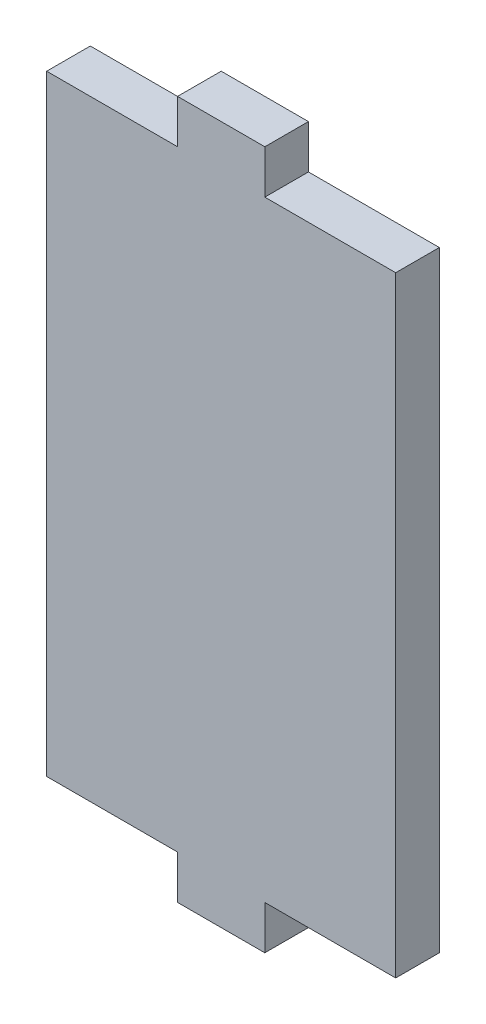
ISO-10303-21;
HEADER;
FILE_DESCRIPTION(('STEP AP214'),'2;1');
FILE_NAME('part.step','',(''),(''),'','','');
FILE_SCHEMA(('AUTOMOTIVE_DESIGN { 1 0 10303 214 1 1 1 1 }'));
ENDSEC;
DATA;
#1=APPLICATION_CONTEXT('core data for automotive mechanical design processes');
#2=APPLICATION_PROTOCOL_DEFINITION('international standard','automotive_design',2000,#1);
#3=PRODUCT_CONTEXT('',#1,'mechanical');
#4=PRODUCT('Part','Part','',(#3));
#5=PRODUCT_RELATED_PRODUCT_CATEGORY('part','',(#4));
#6=PRODUCT_DEFINITION_FORMATION('','',#4);
#7=PRODUCT_DEFINITION_CONTEXT('part definition',#1,'design');
#8=PRODUCT_DEFINITION('design','',#6,#7);
#9=PRODUCT_DEFINITION_SHAPE('','',#8);
#10=(LENGTH_UNIT() NAMED_UNIT(*) SI_UNIT(.MILLI.,.METRE.));
#11=(NAMED_UNIT(*) PLANE_ANGLE_UNIT() SI_UNIT($,.RADIAN.));
#12=(NAMED_UNIT(*) SI_UNIT($,.STERADIAN.) SOLID_ANGLE_UNIT());
#13=UNCERTAINTY_MEASURE_WITH_UNIT(LENGTH_MEASURE(1.E-05),#10,'distance_accuracy_value','');
#14=(GEOMETRIC_REPRESENTATION_CONTEXT(3) GLOBAL_UNCERTAINTY_ASSIGNED_CONTEXT((#13)) GLOBAL_UNIT_ASSIGNED_CONTEXT((#10,
#11,#12)) REPRESENTATION_CONTEXT('',''));
#15=CARTESIAN_POINT('',(0.,0.,0.));
#16=DIRECTION('',(0.,0.,1.));
#17=DIRECTION('',(1.,0.,0.));
#18=AXIS2_PLACEMENT_3D('',#15,#16,#17);
#19=CARTESIAN_POINT('',(3.175,0.,3.175));
#20=DIRECTION('',(-1.,0.,0.));
#21=DIRECTION('',(0.,-1.,0.));
#22=AXIS2_PLACEMENT_3D('',#19,#20,#21);
#23=PLANE('',#22);
#24=DIRECTION('',(0.,1.,0.));
#25=VECTOR('',#24,1.);
#26=CARTESIAN_POINT('',(3.175,0.,0.));
#27=LINE('',#26,#25);
#28=CARTESIAN_POINT('',(3.175,0.,0.));
#29=VERTEX_POINT('',#28);
#30=CARTESIAN_POINT('',(3.175,3.175,0.));
#31=VERTEX_POINT('',#30);
#32=EDGE_CURVE('E247',#29,#31,#27,.T.);
#33=ORIENTED_EDGE('',*,*,#32,.T.);
#34=DIRECTION('',(0.,0.,-1.));
#35=VECTOR('',#34,1.);
#36=CARTESIAN_POINT('',(3.175,3.175,3.175));
#37=LINE('',#36,#35);
#38=CARTESIAN_POINT('',(3.175,3.175,3.175));
#39=VERTEX_POINT('',#38);
#40=EDGE_CURVE('E12',#39,#31,#37,.T.);
#41=ORIENTED_EDGE('',*,*,#40,.F.);
#42=DIRECTION('',(0.,1.,0.));
#43=VECTOR('',#42,1.);
#44=CARTESIAN_POINT('',(3.175,0.,3.175));
#45=LINE('',#44,#43);
#46=CARTESIAN_POINT('',(3.175,0.,3.175));
#47=VERTEX_POINT('',#46);
#48=EDGE_CURVE('E200',#47,#39,#45,.T.);
#49=ORIENTED_EDGE('',*,*,#48,.F.);
#50=DIRECTION('',(0.,0.,-1.));
#51=VECTOR('',#50,1.);
#52=CARTESIAN_POINT('',(3.175,0.,3.175));
#53=LINE('',#52,#51);
#54=EDGE_CURVE('E156',#47,#29,#53,.T.);
#55=ORIENTED_EDGE('',*,*,#54,.T.);
#56=EDGE_LOOP('',(#33,#41,#49,#55));
#57=FACE_BOUND('',#56,.T.);
#58=ADVANCED_FACE('F37',(#57),#23,.F.);
#59=CARTESIAN_POINT('',(3.175,3.175,3.175));
#60=DIRECTION('',(0.,1.,0.));
#61=DIRECTION('',(-1.,0.,0.));
#62=AXIS2_PLACEMENT_3D('',#59,#60,#61);
#63=PLANE('',#62);
#64=DIRECTION('',(1.,0.,0.));
#65=VECTOR('',#64,1.);
#66=CARTESIAN_POINT('',(3.175,3.175,0.));
#67=LINE('',#66,#65);
#68=CARTESIAN_POINT('',(12.7,3.17500000000001,0.));
#69=VERTEX_POINT('',#68);
#70=EDGE_CURVE('E241',#31,#69,#67,.T.);
#71=ORIENTED_EDGE('',*,*,#70,.T.);
#72=DIRECTION('',(0.,0.,-1.));
#73=VECTOR('',#72,1.);
#74=CARTESIAN_POINT('',(12.7,3.17500000000001,3.175));
#75=LINE('',#74,#73);
#76=CARTESIAN_POINT('',(12.7,3.17500000000001,3.175));
#77=VERTEX_POINT('',#76);
#78=EDGE_CURVE('E45',#77,#69,#75,.T.);
#79=ORIENTED_EDGE('',*,*,#78,.F.);
#80=DIRECTION('',(1.,0.,0.));
#81=VECTOR('',#80,1.);
#82=CARTESIAN_POINT('',(3.175,3.175,3.175));
#83=LINE('',#82,#81);
#84=EDGE_CURVE('E108',#39,#77,#83,.T.);
#85=ORIENTED_EDGE('',*,*,#84,.F.);
#86=ORIENTED_EDGE('',*,*,#40,.T.);
#87=EDGE_LOOP('',(#71,#79,#85,#86));
#88=FACE_BOUND('',#87,.T.);
#89=ADVANCED_FACE('F276',(#88),#63,.F.);
#90=CARTESIAN_POINT('',(12.7,3.17500000000001,3.175));
#91=DIRECTION('',(-1.,0.,0.));
#92=DIRECTION('',(0.,0.,1.));
#93=AXIS2_PLACEMENT_3D('',#90,#91,#92);
#94=PLANE('',#93);
#95=DIRECTION('',(0.,1.,0.));
#96=VECTOR('',#95,1.);
#97=CARTESIAN_POINT('',(12.7,3.17500000000001,0.));
#98=LINE('',#97,#96);
#99=CARTESIAN_POINT('',(12.7,47.625,0.));
#100=VERTEX_POINT('',#99);
#101=EDGE_CURVE('E236',#69,#100,#98,.T.);
#102=ORIENTED_EDGE('',*,*,#101,.T.);
#103=DIRECTION('',(0.,0.,-1.));
#104=VECTOR('',#103,1.);
#105=CARTESIAN_POINT('',(12.7,47.625,3.175));
#106=LINE('',#105,#104);
#107=CARTESIAN_POINT('',(12.7,47.625,3.175));
#108=VERTEX_POINT('',#107);
#109=EDGE_CURVE('E228',#108,#100,#106,.T.);
#110=ORIENTED_EDGE('',*,*,#109,.F.);
#111=DIRECTION('',(0.,1.,0.));
#112=VECTOR('',#111,1.);
#113=CARTESIAN_POINT('',(12.7,3.17500000000001,3.175));
#114=LINE('',#113,#112);
#115=EDGE_CURVE('E192',#77,#108,#114,.T.);
#116=ORIENTED_EDGE('',*,*,#115,.F.);
#117=ORIENTED_EDGE('',*,*,#78,.T.);
#118=EDGE_LOOP('',(#102,#110,#116,#117));
#119=FACE_BOUND('',#118,.T.);
#120=ADVANCED_FACE('F234',(#119),#94,.F.);
#121=CARTESIAN_POINT('',(12.7,47.625,3.175));
#122=DIRECTION('',(0.,-1.,0.));
#123=DIRECTION('',(1.,0.,0.));
#124=AXIS2_PLACEMENT_3D('',#121,#122,#123);
#125=PLANE('',#124);
#126=DIRECTION('',(-1.,0.,0.));
#127=VECTOR('',#126,1.);
#128=CARTESIAN_POINT('',(12.7,47.625,0.));
#129=LINE('',#128,#127);
#130=CARTESIAN_POINT('',(3.17499999999999,47.625,0.));
#131=VERTEX_POINT('',#130);
#132=EDGE_CURVE('E243',#100,#131,#129,.T.);
#133=ORIENTED_EDGE('',*,*,#132,.T.);
#134=DIRECTION('',(0.,0.,-1.));
#135=VECTOR('',#134,1.);
#136=CARTESIAN_POINT('',(3.17499999999999,47.625,3.175));
#137=LINE('',#136,#135);
#138=CARTESIAN_POINT('',(3.17499999999999,47.625,3.175));
#139=VERTEX_POINT('',#138);
#140=EDGE_CURVE('E225',#139,#131,#137,.T.);
#141=ORIENTED_EDGE('',*,*,#140,.F.);
#142=DIRECTION('',(-1.,0.,0.));
#143=VECTOR('',#142,1.);
#144=CARTESIAN_POINT('',(12.7,47.625,3.175));
#145=LINE('',#144,#143);
#146=EDGE_CURVE('E188',#108,#139,#145,.T.);
#147=ORIENTED_EDGE('',*,*,#146,.F.);
#148=ORIENTED_EDGE('',*,*,#109,.T.);
#149=EDGE_LOOP('',(#133,#141,#147,#148));
#150=FACE_BOUND('',#149,.T.);
#151=ADVANCED_FACE('F283',(#150),#125,.F.);
#152=CARTESIAN_POINT('',(3.17499999999999,47.625,3.175));
#153=DIRECTION('',(-1.,0.,0.));
#154=DIRECTION('',(0.,-1.,0.));
#155=AXIS2_PLACEMENT_3D('',#152,#153,#154);
#156=PLANE('',#155);
#157=DIRECTION('',(0.,1.,0.));
#158=VECTOR('',#157,1.);
#159=CARTESIAN_POINT('',(3.17499999999999,47.625,0.));
#160=LINE('',#159,#158);
#161=CARTESIAN_POINT('',(3.17499999999999,50.8,0.));
#162=VERTEX_POINT('',#161);
#163=EDGE_CURVE('E245',#131,#162,#160,.T.);
#164=ORIENTED_EDGE('',*,*,#163,.T.);
#165=DIRECTION('',(0.,0.,-1.));
#166=VECTOR('',#165,1.);
#167=CARTESIAN_POINT('',(3.17499999999999,50.8,3.175));
#168=LINE('',#167,#166);
#169=CARTESIAN_POINT('',(3.17499999999999,50.8,3.175));
#170=VERTEX_POINT('',#169);
#171=EDGE_CURVE('E222',#170,#162,#168,.T.);
#172=ORIENTED_EDGE('',*,*,#171,.F.);
#173=DIRECTION('',(0.,1.,0.));
#174=VECTOR('',#173,1.);
#175=CARTESIAN_POINT('',(3.17499999999999,47.625,3.175));
#176=LINE('',#175,#174);
#177=EDGE_CURVE('E185',#139,#170,#176,.T.);
#178=ORIENTED_EDGE('',*,*,#177,.F.);
#179=ORIENTED_EDGE('',*,*,#140,.T.);
#180=EDGE_LOOP('',(#164,#172,#178,#179));
#181=FACE_BOUND('',#180,.T.);
#182=ADVANCED_FACE('F288',(#181),#156,.F.);
#183=CARTESIAN_POINT('',(3.17499999999999,50.8,3.175));
#184=DIRECTION('',(0.,-1.,0.));
#185=DIRECTION('',(0.,0.,-1.));
#186=AXIS2_PLACEMENT_3D('',#183,#184,#185);
#187=PLANE('',#186);
#188=DIRECTION('',(-1.,0.,0.));
#189=VECTOR('',#188,1.);
#190=CARTESIAN_POINT('',(3.17499999999999,50.8,0.));
#191=LINE('',#190,#189);
#192=CARTESIAN_POINT('',(-3.17500000000001,50.8,0.));
#193=VERTEX_POINT('',#192);
#194=EDGE_CURVE('E251',#162,#193,#191,.T.);
#195=ORIENTED_EDGE('',*,*,#194,.T.);
#196=DIRECTION('',(0.,0.,-1.));
#197=VECTOR('',#196,1.);
#198=CARTESIAN_POINT('',(-3.17500000000001,50.8,3.175));
#199=LINE('',#198,#197);
#200=CARTESIAN_POINT('',(-3.17500000000001,50.8,3.175));
#201=VERTEX_POINT('',#200);
#202=EDGE_CURVE('E219',#201,#193,#199,.T.);
#203=ORIENTED_EDGE('',*,*,#202,.F.);
#204=DIRECTION('',(-1.,0.,0.));
#205=VECTOR('',#204,1.);
#206=CARTESIAN_POINT('',(3.17499999999999,50.8,3.175));
#207=LINE('',#206,#205);
#208=EDGE_CURVE('E177',#170,#201,#207,.T.);
#209=ORIENTED_EDGE('',*,*,#208,.F.);
#210=ORIENTED_EDGE('',*,*,#171,.T.);
#211=EDGE_LOOP('',(#195,#203,#209,#210));
#212=FACE_BOUND('',#211,.T.);
#213=ADVANCED_FACE('F292',(#212),#187,.F.);
#214=CARTESIAN_POINT('',(-3.17500000000001,50.8,3.175));
#215=DIRECTION('',(1.,0.,0.));
#216=DIRECTION('',(0.,1.,0.));
#217=AXIS2_PLACEMENT_3D('',#214,#215,#216);
#218=PLANE('',#217);
#219=DIRECTION('',(0.,-1.,0.));
#220=VECTOR('',#219,1.);
#221=CARTESIAN_POINT('',(-3.17500000000001,50.8,0.));
#222=LINE('',#221,#220);
#223=CARTESIAN_POINT('',(-3.17500000000001,47.625,0.));
#224=VERTEX_POINT('',#223);
#225=EDGE_CURVE('E253',#193,#224,#222,.T.);
#226=ORIENTED_EDGE('',*,*,#225,.T.);
#227=DIRECTION('',(0.,0.,-1.));
#228=VECTOR('',#227,1.);
#229=CARTESIAN_POINT('',(-3.17500000000001,47.625,3.175));
#230=LINE('',#229,#228);
#231=CARTESIAN_POINT('',(-3.17500000000001,47.625,3.175));
#232=VERTEX_POINT('',#231);
#233=EDGE_CURVE('E216',#232,#224,#230,.T.);
#234=ORIENTED_EDGE('',*,*,#233,.F.);
#235=DIRECTION('',(0.,-1.,0.));
#236=VECTOR('',#235,1.);
#237=CARTESIAN_POINT('',(-3.17500000000001,50.8,3.175));
#238=LINE('',#237,#236);
#239=EDGE_CURVE('E173',#201,#232,#238,.T.);
#240=ORIENTED_EDGE('',*,*,#239,.F.);
#241=ORIENTED_EDGE('',*,*,#202,.T.);
#242=EDGE_LOOP('',(#226,#234,#240,#241));
#243=FACE_BOUND('',#242,.T.);
#244=ADVANCED_FACE('F296',(#243),#218,.F.);
#245=CARTESIAN_POINT('',(-3.17500000000001,47.625,3.175));
#246=DIRECTION('',(0.,-1.,0.));
#247=DIRECTION('',(0.,0.,-1.));
#248=AXIS2_PLACEMENT_3D('',#245,#246,#247);
#249=PLANE('',#248);
#250=DIRECTION('',(-1.,0.,0.));
#251=VECTOR('',#250,1.);
#252=CARTESIAN_POINT('',(-3.17500000000001,47.625,0.));
#253=LINE('',#252,#251);
#254=CARTESIAN_POINT('',(-12.7,47.625,0.));
#255=VERTEX_POINT('',#254);
#256=EDGE_CURVE('E255',#224,#255,#253,.T.);
#257=ORIENTED_EDGE('',*,*,#256,.T.);
#258=DIRECTION('',(0.,0.,-1.));
#259=VECTOR('',#258,1.);
#260=CARTESIAN_POINT('',(-12.7,47.625,3.175));
#261=LINE('',#260,#259);
#262=CARTESIAN_POINT('',(-12.7,47.625,3.175));
#263=VERTEX_POINT('',#262);
#264=EDGE_CURVE('E213',#263,#255,#261,.T.);
#265=ORIENTED_EDGE('',*,*,#264,.F.);
#266=DIRECTION('',(-1.,0.,0.));
#267=VECTOR('',#266,1.);
#268=CARTESIAN_POINT('',(-3.17500000000001,47.625,3.175));
#269=LINE('',#268,#267);
#270=EDGE_CURVE('E169',#232,#263,#269,.T.);
#271=ORIENTED_EDGE('',*,*,#270,.F.);
#272=ORIENTED_EDGE('',*,*,#233,.T.);
#273=EDGE_LOOP('',(#257,#265,#271,#272));
#274=FACE_BOUND('',#273,.T.);
#275=ADVANCED_FACE('F300',(#274),#249,.F.);
#276=CARTESIAN_POINT('',(-12.7,47.625,3.175));
#277=DIRECTION('',(1.,0.,0.));
#278=DIRECTION('',(0.,1.,0.));
#279=AXIS2_PLACEMENT_3D('',#276,#277,#278);
#280=PLANE('',#279);
#281=DIRECTION('',(0.,-1.,0.));
#282=VECTOR('',#281,1.);
#283=CARTESIAN_POINT('',(-12.7,47.625,0.));
#284=LINE('',#283,#282);
#285=CARTESIAN_POINT('',(-12.7,3.175,0.));
#286=VERTEX_POINT('',#285);
#287=EDGE_CURVE('E257',#255,#286,#284,.T.);
#288=ORIENTED_EDGE('',*,*,#287,.T.);
#289=DIRECTION('',(0.,0.,-1.));
#290=VECTOR('',#289,1.);
#291=CARTESIAN_POINT('',(-12.7,3.175,3.175));
#292=LINE('',#291,#290);
#293=CARTESIAN_POINT('',(-12.7,3.175,3.175));
#294=VERTEX_POINT('',#293);
#295=EDGE_CURVE('E149',#294,#286,#292,.T.);
#296=ORIENTED_EDGE('',*,*,#295,.F.);
#297=DIRECTION('',(0.,-1.,0.));
#298=VECTOR('',#297,1.);
#299=CARTESIAN_POINT('',(-12.7,47.625,3.175));
#300=LINE('',#299,#298);
#301=EDGE_CURVE('E139',#263,#294,#300,.T.);
#302=ORIENTED_EDGE('',*,*,#301,.F.);
#303=ORIENTED_EDGE('',*,*,#264,.T.);
#304=EDGE_LOOP('',(#288,#296,#302,#303));
#305=FACE_BOUND('',#304,.T.);
#306=ADVANCED_FACE('F260',(#305),#280,.F.);
#307=CARTESIAN_POINT('',(-12.7,3.175,3.175));
#308=DIRECTION('',(0.,1.,0.));
#309=DIRECTION('',(-1.,0.,0.));
#310=AXIS2_PLACEMENT_3D('',#307,#308,#309);
#311=PLANE('',#310);
#312=DIRECTION('',(1.,0.,0.));
#313=VECTOR('',#312,1.);
#314=CARTESIAN_POINT('',(-12.7,3.175,0.));
#315=LINE('',#314,#313);
#316=CARTESIAN_POINT('',(-3.175,3.175,0.));
#317=VERTEX_POINT('',#316);
#318=EDGE_CURVE('E148',#286,#317,#315,.T.);
#319=ORIENTED_EDGE('',*,*,#318,.T.);
#320=DIRECTION('',(0.,0.,-1.));
#321=VECTOR('',#320,1.);
#322=CARTESIAN_POINT('',(-3.175,3.175,3.175));
#323=LINE('',#322,#321);
#324=CARTESIAN_POINT('',(-3.175,3.175,3.175));
#325=VERTEX_POINT('',#324);
#326=EDGE_CURVE('E145',#325,#317,#323,.T.);
#327=ORIENTED_EDGE('',*,*,#326,.F.);
#328=DIRECTION('',(1.,0.,0.));
#329=VECTOR('',#328,1.);
#330=CARTESIAN_POINT('',(-12.7,3.175,3.175));
#331=LINE('',#330,#329);
#332=EDGE_CURVE('E133',#294,#325,#331,.T.);
#333=ORIENTED_EDGE('',*,*,#332,.F.);
#334=ORIENTED_EDGE('',*,*,#295,.T.);
#335=EDGE_LOOP('',(#319,#327,#333,#334));
#336=FACE_BOUND('',#335,.T.);
#337=ADVANCED_FACE('F146',(#336),#311,.F.);
#338=CARTESIAN_POINT('',(-3.175,3.175,3.175));
#339=DIRECTION('',(1.,0.,0.));
#340=DIRECTION('',(0.,1.,0.));
#341=AXIS2_PLACEMENT_3D('',#338,#339,#340);
#342=PLANE('',#341);
#343=DIRECTION('',(0.,-1.,0.));
#344=VECTOR('',#343,1.);
#345=CARTESIAN_POINT('',(-3.175,3.175,0.));
#346=LINE('',#345,#344);
#347=CARTESIAN_POINT('',(-3.175,0.,0.));
#348=VERTEX_POINT('',#347);
#349=EDGE_CURVE('E94',#317,#348,#346,.T.);
#350=ORIENTED_EDGE('',*,*,#349,.T.);
#351=DIRECTION('',(0.,0.,-1.));
#352=VECTOR('',#351,1.);
#353=CARTESIAN_POINT('',(-3.175,0.,3.175));
#354=LINE('',#353,#352);
#355=CARTESIAN_POINT('',(-3.175,0.,3.175));
#356=VERTEX_POINT('',#355);
#357=EDGE_CURVE('E150',#356,#348,#354,.T.);
#358=ORIENTED_EDGE('',*,*,#357,.F.);
#359=DIRECTION('',(0.,-1.,0.));
#360=VECTOR('',#359,1.);
#361=CARTESIAN_POINT('',(-3.175,3.175,3.175));
#362=LINE('',#361,#360);
#363=EDGE_CURVE('E137',#325,#356,#362,.T.);
#364=ORIENTED_EDGE('',*,*,#363,.F.);
#365=ORIENTED_EDGE('',*,*,#326,.T.);
#366=EDGE_LOOP('',(#350,#358,#364,#365));
#367=FACE_BOUND('',#366,.T.);
#368=ADVANCED_FACE('F152',(#367),#342,.F.);
#369=CARTESIAN_POINT('',(-3.175,0.,3.175));
#370=DIRECTION('',(0.,1.,0.));
#371=DIRECTION('',(0.,0.,1.));
#372=AXIS2_PLACEMENT_3D('',#369,#370,#371);
#373=PLANE('',#372);
#374=DIRECTION('',(1.,0.,0.));
#375=VECTOR('',#374,1.);
#376=CARTESIAN_POINT('',(-3.175,0.,0.));
#377=LINE('',#376,#375);
#378=EDGE_CURVE('E100',#348,#29,#377,.T.);
#379=ORIENTED_EDGE('',*,*,#378,.T.);
#380=ORIENTED_EDGE('',*,*,#54,.F.);
#381=DIRECTION('',(1.,0.,0.));
#382=VECTOR('',#381,1.);
#383=CARTESIAN_POINT('',(-3.175,0.,3.175));
#384=LINE('',#383,#382);
#385=EDGE_CURVE('E53',#356,#47,#384,.T.);
#386=ORIENTED_EDGE('',*,*,#385,.F.);
#387=ORIENTED_EDGE('',*,*,#357,.T.);
#388=EDGE_LOOP('',(#379,#380,#386,#387));
#389=FACE_BOUND('',#388,.T.);
#390=ADVANCED_FACE('F265',(#389),#373,.F.);
#391=CARTESIAN_POINT('',(0.,0.,3.175));
#392=DIRECTION('',(0.,0.,-1.));
#393=DIRECTION('',(-1.,0.,0.));
#394=AXIS2_PLACEMENT_3D('',#391,#392,#393);
#395=PLANE('',#394);
#396=ORIENTED_EDGE('',*,*,#48,.T.);
#397=ORIENTED_EDGE('',*,*,#84,.T.);
#398=ORIENTED_EDGE('',*,*,#115,.T.);
#399=ORIENTED_EDGE('',*,*,#146,.T.);
#400=ORIENTED_EDGE('',*,*,#177,.T.);
#401=ORIENTED_EDGE('',*,*,#208,.T.);
#402=ORIENTED_EDGE('',*,*,#239,.T.);
#403=ORIENTED_EDGE('',*,*,#270,.T.);
#404=ORIENTED_EDGE('',*,*,#301,.T.);
#405=ORIENTED_EDGE('',*,*,#332,.T.);
#406=ORIENTED_EDGE('',*,*,#363,.T.);
#407=ORIENTED_EDGE('',*,*,#385,.T.);
#408=EDGE_LOOP('',(#396,#397,#398,#399,#400,#401,#402,#403,#404,#405,#406,#407));
#409=FACE_BOUND('',#408,.T.);
#410=ADVANCED_FACE('F135',(#409),#395,.F.);
#411=CARTESIAN_POINT('',(0.,0.,0.));
#412=DIRECTION('',(0.,0.,-1.));
#413=DIRECTION('',(-1.,0.,0.));
#414=AXIS2_PLACEMENT_3D('',#411,#412,#413);
#415=PLANE('',#414);
#416=ORIENTED_EDGE('',*,*,#32,.F.);
#417=ORIENTED_EDGE('',*,*,#378,.F.);
#418=ORIENTED_EDGE('',*,*,#349,.F.);
#419=ORIENTED_EDGE('',*,*,#318,.F.);
#420=ORIENTED_EDGE('',*,*,#287,.F.);
#421=ORIENTED_EDGE('',*,*,#256,.F.);
#422=ORIENTED_EDGE('',*,*,#225,.F.);
#423=ORIENTED_EDGE('',*,*,#194,.F.);
#424=ORIENTED_EDGE('',*,*,#163,.F.);
#425=ORIENTED_EDGE('',*,*,#132,.F.);
#426=ORIENTED_EDGE('',*,*,#101,.F.);
#427=ORIENTED_EDGE('',*,*,#70,.F.);
#428=EDGE_LOOP('',(#416,#417,#418,#419,#420,#421,#422,#423,#424,#425,#426,#427));
#429=FACE_BOUND('',#428,.T.);
#430=ADVANCED_FACE('F240',(#429),#415,.T.);
#431=CLOSED_SHELL('',(#58,#89,#120,#151,#182,#213,#244,#275,#306,#337,#368,#390,#410,#430));
#432=MANIFOLD_SOLID_BREP('B2',#431);
#433=ADVANCED_BREP_SHAPE_REPRESENTATION('',(#18,#432),#14);
#434=SHAPE_DEFINITION_REPRESENTATION(#9,#433);
ENDSEC;
END-ISO-10303-21;
